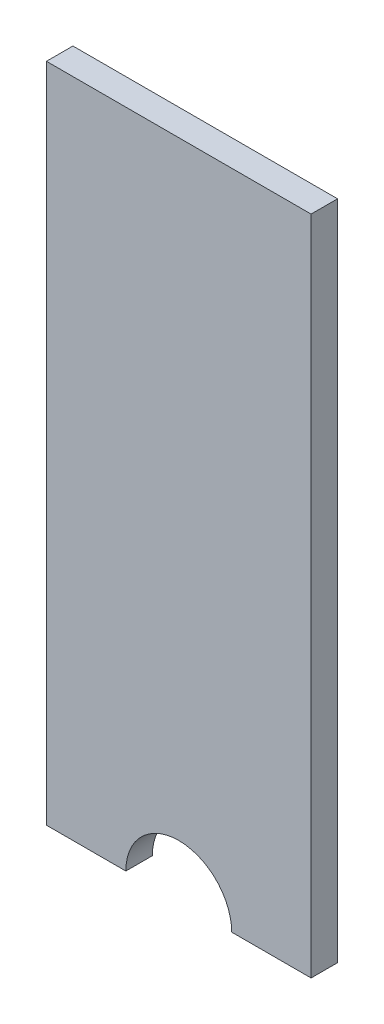
ISO-10303-21;
HEADER;
FILE_DESCRIPTION(('STEP AP214'),'2;1');
FILE_NAME('part.step','',(''),(''),'','','');
FILE_SCHEMA(('AUTOMOTIVE_DESIGN { 1 0 10303 214 1 1 1 1 }'));
ENDSEC;
DATA;
#1=APPLICATION_CONTEXT('core data for automotive mechanical design processes');
#2=APPLICATION_PROTOCOL_DEFINITION('international standard','automotive_design',2000,#1);
#3=PRODUCT_CONTEXT('',#1,'mechanical');
#4=PRODUCT('Part','Part','',(#3));
#5=PRODUCT_RELATED_PRODUCT_CATEGORY('part','',(#4));
#6=PRODUCT_DEFINITION_FORMATION('','',#4);
#7=PRODUCT_DEFINITION_CONTEXT('part definition',#1,'design');
#8=PRODUCT_DEFINITION('design','',#6,#7);
#9=PRODUCT_DEFINITION_SHAPE('','',#8);
#10=(LENGTH_UNIT() NAMED_UNIT(*) SI_UNIT(.MILLI.,.METRE.));
#11=(NAMED_UNIT(*) PLANE_ANGLE_UNIT() SI_UNIT($,.RADIAN.));
#12=(NAMED_UNIT(*) SI_UNIT($,.STERADIAN.) SOLID_ANGLE_UNIT());
#13=UNCERTAINTY_MEASURE_WITH_UNIT(LENGTH_MEASURE(1.E-05),#10,'distance_accuracy_value','');
#14=(GEOMETRIC_REPRESENTATION_CONTEXT(3) GLOBAL_UNCERTAINTY_ASSIGNED_CONTEXT((#13)) GLOBAL_UNIT_ASSIGNED_CONTEXT((#10,
#11,#12)) REPRESENTATION_CONTEXT('',''));
#15=CARTESIAN_POINT('',(0.,0.,0.));
#16=DIRECTION('',(0.,0.,1.));
#17=DIRECTION('',(1.,0.,0.));
#18=AXIS2_PLACEMENT_3D('',#15,#16,#17);
#19=CARTESIAN_POINT('',(38.585402864172,-159.604667746467,20.));
#20=DIRECTION('',(0.,1.,0.));
#21=DIRECTION('',(-1.,0.,0.));
#22=AXIS2_PLACEMENT_3D('',#19,#20,#21);
#23=PLANE('',#22);
#24=DIRECTION('',(1.,0.,0.));
#25=VECTOR('',#24,1.);
#26=CARTESIAN_POINT('',(38.585402864172,-159.604667746467,0.));
#27=LINE('',#26,#25);
#28=CARTESIAN_POINT('',(-161.414597135828,-159.604667746467,0.));
#29=VERTEX_POINT('',#28);
#30=CARTESIAN_POINT('',(-101.414597135828,-159.604667746467,0.));
#31=VERTEX_POINT('',#30);
#32=EDGE_CURVE('E122',#29,#31,#27,.T.);
#33=ORIENTED_EDGE('',*,*,#32,.T.);
#34=DIRECTION('',(0.,0.,1.));
#35=VECTOR('',#34,1.);
#36=CARTESIAN_POINT('',(-101.414597135828,-159.604667746467,-48.));
#37=LINE('',#36,#35);
#38=CARTESIAN_POINT('',(-101.414597135828,-159.604667746467,20.));
#39=VERTEX_POINT('',#38);
#40=EDGE_CURVE('E47',#31,#39,#37,.T.);
#41=ORIENTED_EDGE('',*,*,#40,.T.);
#42=DIRECTION('',(1.,0.,0.));
#43=VECTOR('',#42,1.);
#44=CARTESIAN_POINT('',(38.585402864172,-159.604667746467,20.));
#45=LINE('',#44,#43);
#46=CARTESIAN_POINT('',(-161.414597135828,-159.604667746467,20.));
#47=VERTEX_POINT('',#46);
#48=EDGE_CURVE('E84',#47,#39,#45,.T.);
#49=ORIENTED_EDGE('',*,*,#48,.F.);
#50=DIRECTION('',(0.,0.,-1.));
#51=VECTOR('',#50,1.);
#52=CARTESIAN_POINT('',(-161.414597135828,-159.604667746467,20.));
#53=LINE('',#52,#51);
#54=EDGE_CURVE('E41',#47,#29,#53,.T.);
#55=ORIENTED_EDGE('',*,*,#54,.T.);
#56=EDGE_LOOP('',(#33,#41,#49,#55));
#57=FACE_BOUND('',#56,.T.);
#58=ADVANCED_FACE('F33',(#57),#23,.F.);
#59=CARTESIAN_POINT('',(-161.414597135828,-159.604667746467,20.));
#60=DIRECTION('',(1.,0.,0.));
#61=DIRECTION('',(0.,0.,-1.));
#62=AXIS2_PLACEMENT_3D('',#59,#60,#61);
#63=PLANE('',#62);
#64=DIRECTION('',(0.,-1.,0.));
#65=VECTOR('',#64,1.);
#66=CARTESIAN_POINT('',(-161.414597135828,-159.604667746467,0.));
#67=LINE('',#66,#65);
#68=CARTESIAN_POINT('',(-161.414597135828,340.395332253533,0.));
#69=VERTEX_POINT('',#68);
#70=EDGE_CURVE('E118',#69,#29,#67,.T.);
#71=ORIENTED_EDGE('',*,*,#70,.T.);
#72=ORIENTED_EDGE('',*,*,#54,.F.);
#73=DIRECTION('',(0.,-1.,0.));
#74=VECTOR('',#73,1.);
#75=CARTESIAN_POINT('',(-161.414597135828,-159.604667746467,20.));
#76=LINE('',#75,#74);
#77=CARTESIAN_POINT('',(-161.414597135828,340.395332253533,20.));
#78=VERTEX_POINT('',#77);
#79=EDGE_CURVE('E109',#78,#47,#76,.T.);
#80=ORIENTED_EDGE('',*,*,#79,.F.);
#81=DIRECTION('',(0.,0.,-1.));
#82=VECTOR('',#81,1.);
#83=CARTESIAN_POINT('',(-161.414597135828,340.395332253533,20.));
#84=LINE('',#83,#82);
#85=EDGE_CURVE('E117',#78,#69,#84,.T.);
#86=ORIENTED_EDGE('',*,*,#85,.T.);
#87=EDGE_LOOP('',(#71,#72,#80,#86));
#88=FACE_BOUND('',#87,.T.);
#89=ADVANCED_FACE('F35',(#88),#63,.F.);
#90=CARTESIAN_POINT('',(-21.414597135828,-159.604667746467,20.));
#91=VERTEX_POINT('',#90);
#92=CARTESIAN_POINT('',(38.585402864172,-159.604667746467,20.));
#93=VERTEX_POINT('',#92);
#94=EDGE_CURVE('E102',#91,#93,#45,.T.);
#95=ORIENTED_EDGE('',*,*,#94,.F.);
#96=DIRECTION('',(0.,0.,1.));
#97=VECTOR('',#96,1.);
#98=CARTESIAN_POINT('',(-21.414597135828,-159.604667746467,-48.));
#99=LINE('',#98,#97);
#100=CARTESIAN_POINT('',(-21.414597135828,-159.604667746467,0.));
#101=VERTEX_POINT('',#100);
#102=EDGE_CURVE('E93',#91,#101,#99,.F.);
#103=ORIENTED_EDGE('',*,*,#102,.T.);
#104=CARTESIAN_POINT('',(38.585402864172,-159.604667746467,0.));
#105=VERTEX_POINT('',#104);
#106=EDGE_CURVE('E121',#101,#105,#27,.T.);
#107=ORIENTED_EDGE('',*,*,#106,.T.);
#108=DIRECTION('',(0.,0.,-1.));
#109=VECTOR('',#108,1.);
#110=CARTESIAN_POINT('',(38.585402864172,-159.604667746467,20.));
#111=LINE('',#110,#109);
#112=EDGE_CURVE('E107',#93,#105,#111,.T.);
#113=ORIENTED_EDGE('',*,*,#112,.F.);
#114=EDGE_LOOP('',(#95,#103,#107,#113));
#115=FACE_BOUND('',#114,.T.);
#116=ADVANCED_FACE('F105',(#115),#23,.F.);
#117=CARTESIAN_POINT('',(38.5854028641719,340.395332253533,20.));
#118=DIRECTION('',(-1.,0.,0.));
#119=DIRECTION('',(0.,-1.,0.));
#120=AXIS2_PLACEMENT_3D('',#117,#118,#119);
#121=PLANE('',#120);
#122=DIRECTION('',(0.,1.,0.));
#123=VECTOR('',#122,1.);
#124=CARTESIAN_POINT('',(38.5854028641719,340.395332253533,0.));
#125=LINE('',#124,#123);
#126=CARTESIAN_POINT('',(38.5854028641719,340.395332253533,0.));
#127=VERTEX_POINT('',#126);
#128=EDGE_CURVE('E125',#105,#127,#125,.T.);
#129=ORIENTED_EDGE('',*,*,#128,.T.);
#130=DIRECTION('',(0.,0.,-1.));
#131=VECTOR('',#130,1.);
#132=CARTESIAN_POINT('',(38.5854028641719,340.395332253533,20.));
#133=LINE('',#132,#131);
#134=CARTESIAN_POINT('',(38.5854028641719,340.395332253533,20.));
#135=VERTEX_POINT('',#134);
#136=EDGE_CURVE('E129',#135,#127,#133,.T.);
#137=ORIENTED_EDGE('',*,*,#136,.F.);
#138=DIRECTION('',(0.,1.,0.));
#139=VECTOR('',#138,1.);
#140=CARTESIAN_POINT('',(38.5854028641719,340.395332253533,20.));
#141=LINE('',#140,#139);
#142=EDGE_CURVE('E111',#93,#135,#141,.T.);
#143=ORIENTED_EDGE('',*,*,#142,.F.);
#144=ORIENTED_EDGE('',*,*,#112,.T.);
#145=EDGE_LOOP('',(#129,#137,#143,#144));
#146=FACE_BOUND('',#145,.T.);
#147=ADVANCED_FACE('F139',(#146),#121,.F.);
#148=CARTESIAN_POINT('',(-161.414597135828,340.395332253533,20.));
#149=DIRECTION('',(0.,-1.,0.));
#150=DIRECTION('',(0.,0.,-1.));
#151=AXIS2_PLACEMENT_3D('',#148,#149,#150);
#152=PLANE('',#151);
#153=DIRECTION('',(-1.,0.,0.));
#154=VECTOR('',#153,1.);
#155=CARTESIAN_POINT('',(-161.414597135828,340.395332253533,0.));
#156=LINE('',#155,#154);
#157=EDGE_CURVE('E77',#127,#69,#156,.T.);
#158=ORIENTED_EDGE('',*,*,#157,.T.);
#159=ORIENTED_EDGE('',*,*,#85,.F.);
#160=DIRECTION('',(-1.,0.,0.));
#161=VECTOR('',#160,1.);
#162=CARTESIAN_POINT('',(-161.414597135828,340.395332253533,20.));
#163=LINE('',#162,#161);
#164=EDGE_CURVE('E56',#135,#78,#163,.T.);
#165=ORIENTED_EDGE('',*,*,#164,.F.);
#166=ORIENTED_EDGE('',*,*,#136,.T.);
#167=EDGE_LOOP('',(#158,#159,#165,#166));
#168=FACE_BOUND('',#167,.T.);
#169=ADVANCED_FACE('F141',(#168),#152,.F.);
#170=CARTESIAN_POINT('',(0.,0.,20.));
#171=DIRECTION('',(0.,0.,-1.));
#172=DIRECTION('',(-1.,0.,0.));
#173=AXIS2_PLACEMENT_3D('',#170,#171,#172);
#174=PLANE('',#173);
#175=ORIENTED_EDGE('',*,*,#48,.T.);
#176=CARTESIAN_POINT('',(-61.414597135828,-159.604667746467,20.));
#177=DIRECTION('',(0.,0.,1.));
#178=DIRECTION('',(1.,0.,0.));
#179=AXIS2_PLACEMENT_3D('',#176,#177,#178);
#180=CIRCLE('',#179,40.);
#181=EDGE_CURVE('E96',#91,#39,#180,.T.);
#182=ORIENTED_EDGE('',*,*,#181,.F.);
#183=ORIENTED_EDGE('',*,*,#94,.T.);
#184=ORIENTED_EDGE('',*,*,#142,.T.);
#185=ORIENTED_EDGE('',*,*,#164,.T.);
#186=ORIENTED_EDGE('',*,*,#79,.T.);
#187=EDGE_LOOP('',(#175,#182,#183,#184,#185,#186));
#188=FACE_BOUND('',#187,.T.);
#189=ADVANCED_FACE('F101',(#188),#174,.F.);
#190=CARTESIAN_POINT('',(0.,0.,0.));
#191=DIRECTION('',(0.,0.,-1.));
#192=DIRECTION('',(-1.,0.,0.));
#193=AXIS2_PLACEMENT_3D('',#190,#191,#192);
#194=PLANE('',#193);
#195=CARTESIAN_POINT('',(-61.414597135828,-159.604667746467,0.));
#196=DIRECTION('',(0.,0.,-1.));
#197=DIRECTION('',(-1.,0.,0.));
#198=AXIS2_PLACEMENT_3D('',#195,#196,#197);
#199=CIRCLE('',#198,40.);
#200=EDGE_CURVE('E11',#31,#101,#199,.T.);
#201=ORIENTED_EDGE('',*,*,#200,.F.);
#202=ORIENTED_EDGE('',*,*,#32,.F.);
#203=ORIENTED_EDGE('',*,*,#70,.F.);
#204=ORIENTED_EDGE('',*,*,#157,.F.);
#205=ORIENTED_EDGE('',*,*,#128,.F.);
#206=ORIENTED_EDGE('',*,*,#106,.F.);
#207=EDGE_LOOP('',(#201,#202,#203,#204,#205,#206));
#208=FACE_BOUND('',#207,.T.);
#209=ADVANCED_FACE('F136',(#208),#194,.T.);
#210=CARTESIAN_POINT('',(-61.414597135828,-159.604667746467,-48.));
#211=DIRECTION('',(0.,0.,1.));
#212=DIRECTION('',(1.,0.,0.));
#213=AXIS2_PLACEMENT_3D('',#210,#211,#212);
#214=CYLINDRICAL_SURFACE('',#213,40.);
#215=ORIENTED_EDGE('',*,*,#200,.T.);
#216=ORIENTED_EDGE('',*,*,#102,.F.);
#217=ORIENTED_EDGE('',*,*,#181,.T.);
#218=ORIENTED_EDGE('',*,*,#40,.F.);
#219=EDGE_LOOP('',(#215,#216,#217,#218));
#220=FACE_BOUND('',#219,.T.);
#221=ADVANCED_FACE('F95',(#220),#214,.F.);
#222=CLOSED_SHELL('',(#58,#89,#116,#147,#169,#189,#209,#221));
#223=MANIFOLD_SOLID_BREP('B2',#222);
#224=ADVANCED_BREP_SHAPE_REPRESENTATION('',(#18,#223),#14);
#225=SHAPE_DEFINITION_REPRESENTATION(#9,#224);
ENDSEC;
END-ISO-10303-21;
